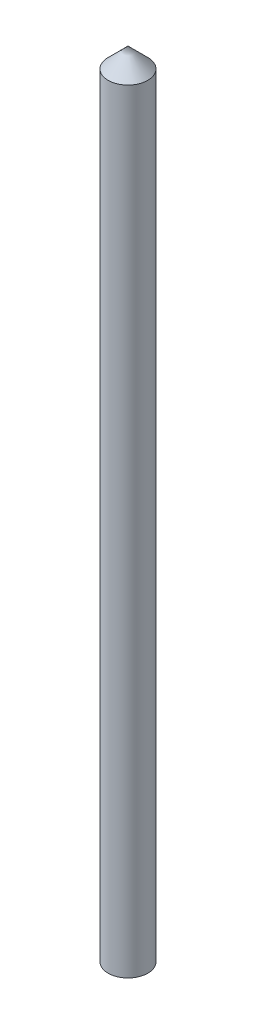
ISO-10303-21;
HEADER;
FILE_DESCRIPTION(('STEP AP214'),'2;1');
FILE_NAME('part.step','',(''),(''),'','','');
FILE_SCHEMA(('AUTOMOTIVE_DESIGN { 1 0 10303 214 1 1 1 1 }'));
ENDSEC;
DATA;
#1=APPLICATION_CONTEXT('core data for automotive mechanical design processes');
#2=APPLICATION_PROTOCOL_DEFINITION('international standard','automotive_design',2000,#1);
#3=PRODUCT_CONTEXT('',#1,'mechanical');
#4=PRODUCT('Part','Part','',(#3));
#5=PRODUCT_RELATED_PRODUCT_CATEGORY('part','',(#4));
#6=PRODUCT_DEFINITION_FORMATION('','',#4);
#7=PRODUCT_DEFINITION_CONTEXT('part definition',#1,'design');
#8=PRODUCT_DEFINITION('design','',#6,#7);
#9=PRODUCT_DEFINITION_SHAPE('','',#8);
#10=(LENGTH_UNIT() NAMED_UNIT(*) SI_UNIT(.MILLI.,.METRE.));
#11=(NAMED_UNIT(*) PLANE_ANGLE_UNIT() SI_UNIT($,.RADIAN.));
#12=(NAMED_UNIT(*) SI_UNIT($,.STERADIAN.) SOLID_ANGLE_UNIT());
#13=UNCERTAINTY_MEASURE_WITH_UNIT(LENGTH_MEASURE(1.E-05),#10,'distance_accuracy_value','');
#14=(GEOMETRIC_REPRESENTATION_CONTEXT(3) GLOBAL_UNCERTAINTY_ASSIGNED_CONTEXT((#13)) GLOBAL_UNIT_ASSIGNED_CONTEXT((#10,
#11,#12)) REPRESENTATION_CONTEXT('',''));
#15=CARTESIAN_POINT('',(0.,0.,0.));
#16=DIRECTION('',(0.,0.,1.));
#17=DIRECTION('',(1.,0.,0.));
#18=AXIS2_PLACEMENT_3D('',#15,#16,#17);
#19=CARTESIAN_POINT('',(0.,120.,0.));
#20=DIRECTION('',(0.,-1.,0.));
#21=DIRECTION('',(0.,0.,-1.));
#22=AXIS2_PLACEMENT_3D('',#19,#20,#21);
#23=CYLINDRICAL_SURFACE('',#22,3.);
#24=CARTESIAN_POINT('',(0.,117.,0.));
#25=DIRECTION('',(0.,1.,0.));
#26=DIRECTION('',(0.,0.,1.));
#27=AXIS2_PLACEMENT_3D('',#24,#25,#26);
#28=CIRCLE('',#27,3.);
#29=CARTESIAN_POINT('',(0.,117.,3.));
#30=VERTEX_POINT('',#29);
#31=EDGE_CURVE('E11',#30,#30,#28,.F.);
#32=ORIENTED_EDGE('',*,*,#31,.T.);
#33=EDGE_LOOP('',(#32));
#34=FACE_BOUND('',#33,.T.);
#35=CARTESIAN_POINT('',(0.,0.,0.));
#36=DIRECTION('',(0.,1.,0.));
#37=DIRECTION('',(0.,0.,1.));
#38=AXIS2_PLACEMENT_3D('',#35,#36,#37);
#39=CIRCLE('',#38,3.);
#40=CARTESIAN_POINT('',(0.,0.,3.));
#41=VERTEX_POINT('',#40);
#42=EDGE_CURVE('E50',#41,#41,#39,.T.);
#43=ORIENTED_EDGE('',*,*,#42,.T.);
#44=EDGE_LOOP('',(#43));
#45=FACE_BOUND('',#44,.T.);
#46=ADVANCED_FACE('F41',(#34,#45),#23,.T.);
#47=CARTESIAN_POINT('',(0.,0.,0.));
#48=DIRECTION('',(0.,1.,0.));
#49=DIRECTION('',(0.,0.,1.));
#50=AXIS2_PLACEMENT_3D('',#47,#48,#49);
#51=PLANE('',#50);
#52=ORIENTED_EDGE('',*,*,#42,.F.);
#53=EDGE_LOOP('',(#52));
#54=FACE_BOUND('',#53,.T.);
#55=ADVANCED_FACE('F54',(#54),#51,.F.);
#56=CARTESIAN_POINT('',(0.,117.,0.));
#57=DIRECTION('',(0.,-1.,0.));
#58=DIRECTION('',(0.,0.,-1.));
#59=AXIS2_PLACEMENT_3D('',#56,#57,#58);
#60=CONICAL_SURFACE('',#59,3.00000000000001,0.785398163397446);
#61=ORIENTED_EDGE('',*,*,#31,.F.);
#62=EDGE_LOOP('',(#61));
#63=FACE_BOUND('',#62,.T.);
#64=CARTESIAN_POINT('',(0.,120.,0.));
#65=VERTEX_POINT('',#64);
#66=VERTEX_LOOP('',#65);
#67=FACE_BOUND('',#66,.T.);
#68=ADVANCED_FACE('F44',(#63,#67),#60,.T.);
#69=CLOSED_SHELL('',(#46,#55,#68));
#70=MANIFOLD_SOLID_BREP('B2',#69);
#71=ADVANCED_BREP_SHAPE_REPRESENTATION('',(#18,#70),#14);
#72=SHAPE_DEFINITION_REPRESENTATION(#9,#71);
ENDSEC;
END-ISO-10303-21;
